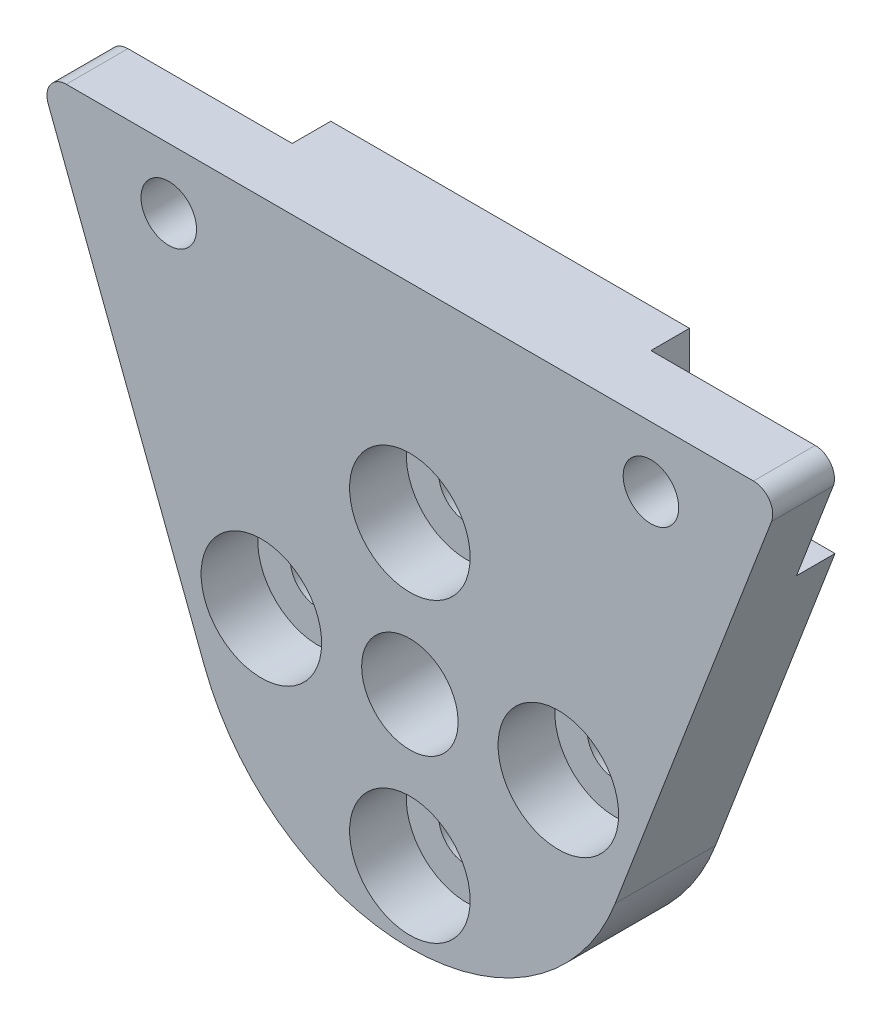
ISO-10303-21;
HEADER;
FILE_DESCRIPTION(('STEP AP214'),'2;1');
FILE_NAME('part.step','',(''),(''),'','','');
FILE_SCHEMA(('AUTOMOTIVE_DESIGN { 1 0 10303 214 1 1 1 1 }'));
ENDSEC;
DATA;
#1=APPLICATION_CONTEXT('core data for automotive mechanical design processes');
#2=APPLICATION_PROTOCOL_DEFINITION('international standard','automotive_design',2000,#1);
#3=PRODUCT_CONTEXT('',#1,'mechanical');
#4=PRODUCT('Part','Part','',(#3));
#5=PRODUCT_RELATED_PRODUCT_CATEGORY('part','',(#4));
#6=PRODUCT_DEFINITION_FORMATION('','',#4);
#7=PRODUCT_DEFINITION_CONTEXT('part definition',#1,'design');
#8=PRODUCT_DEFINITION('design','',#6,#7);
#9=PRODUCT_DEFINITION_SHAPE('','',#8);
#10=(LENGTH_UNIT() NAMED_UNIT(*) SI_UNIT(.MILLI.,.METRE.));
#11=(NAMED_UNIT(*) PLANE_ANGLE_UNIT() SI_UNIT($,.RADIAN.));
#12=(NAMED_UNIT(*) SI_UNIT($,.STERADIAN.) SOLID_ANGLE_UNIT());
#13=UNCERTAINTY_MEASURE_WITH_UNIT(LENGTH_MEASURE(1.E-05),#10,'distance_accuracy_value','');
#14=(GEOMETRIC_REPRESENTATION_CONTEXT(3) GLOBAL_UNCERTAINTY_ASSIGNED_CONTEXT((#13)) GLOBAL_UNIT_ASSIGNED_CONTEXT((#10,
#11,#12)) REPRESENTATION_CONTEXT('',''));
#15=CARTESIAN_POINT('',(0.,0.,0.));
#16=DIRECTION('',(0.,0.,1.));
#17=DIRECTION('',(1.,0.,0.));
#18=AXIS2_PLACEMENT_3D('',#15,#16,#17);
#19=CARTESIAN_POINT('',(-15.875,14.9987,0.));
#20=DIRECTION('',(0.,0.,-1.));
#21=DIRECTION('',(-1.,0.,0.));
#22=AXIS2_PLACEMENT_3D('',#19,#20,#21);
#23=CYLINDRICAL_SURFACE('',#22,1.8288);
#24=CARTESIAN_POINT('',(-15.875,14.9987,6.604));
#25=DIRECTION('',(0.,0.,-1.));
#26=DIRECTION('',(-1.,0.,0.));
#27=AXIS2_PLACEMENT_3D('',#24,#25,#26);
#28=CIRCLE('',#27,1.8288);
#29=CARTESIAN_POINT('',(-17.7038,14.9987,6.604));
#30=VERTEX_POINT('',#29);
#31=EDGE_CURVE('E214',#30,#30,#28,.T.);
#32=ORIENTED_EDGE('',*,*,#31,.F.);
#33=EDGE_LOOP('',(#32));
#34=FACE_BOUND('',#33,.T.);
#35=CARTESIAN_POINT('',(-15.875,14.9987,2.54));
#36=DIRECTION('',(0.,0.,-1.));
#37=DIRECTION('',(-1.,0.,0.));
#38=AXIS2_PLACEMENT_3D('',#35,#36,#37);
#39=CIRCLE('',#38,1.8288);
#40=CARTESIAN_POINT('',(-17.7038,14.9987,2.54));
#41=VERTEX_POINT('',#40);
#42=EDGE_CURVE('E175',#41,#41,#39,.F.);
#43=ORIENTED_EDGE('',*,*,#42,.F.);
#44=EDGE_LOOP('',(#43));
#45=FACE_BOUND('',#44,.T.);
#46=ADVANCED_FACE('F35',(#34,#45),#23,.F.);
#47=CARTESIAN_POINT('',(15.875,14.9987,0.));
#48=DIRECTION('',(0.,0.,-1.));
#49=DIRECTION('',(-1.,0.,0.));
#50=AXIS2_PLACEMENT_3D('',#47,#48,#49);
#51=CYLINDRICAL_SURFACE('',#50,1.8288);
#52=CARTESIAN_POINT('',(15.875,14.9987,6.604));
#53=DIRECTION('',(0.,0.,-1.));
#54=DIRECTION('',(-1.,0.,0.));
#55=AXIS2_PLACEMENT_3D('',#52,#53,#54);
#56=CIRCLE('',#55,1.8288);
#57=CARTESIAN_POINT('',(14.0462,14.9987,6.604));
#58=VERTEX_POINT('',#57);
#59=EDGE_CURVE('E211',#58,#58,#56,.T.);
#60=ORIENTED_EDGE('',*,*,#59,.F.);
#61=EDGE_LOOP('',(#60));
#62=FACE_BOUND('',#61,.T.);
#63=CARTESIAN_POINT('',(15.875,14.9987,2.54));
#64=DIRECTION('',(0.,0.,-1.));
#65=DIRECTION('',(-1.,0.,0.));
#66=AXIS2_PLACEMENT_3D('',#63,#64,#65);
#67=CIRCLE('',#66,1.8288);
#68=CARTESIAN_POINT('',(14.0462,14.9987,2.54));
#69=VERTEX_POINT('',#68);
#70=EDGE_CURVE('E205',#69,#69,#67,.F.);
#71=ORIENTED_EDGE('',*,*,#70,.F.);
#72=EDGE_LOOP('',(#71));
#73=FACE_BOUND('',#72,.T.);
#74=ADVANCED_FACE('F326',(#62,#73),#51,.F.);
#75=CARTESIAN_POINT('',(0.,-4.48645472172612,6.604));
#76=DIRECTION('',(0.,0.,1.));
#77=DIRECTION('',(1.,0.,0.));
#78=AXIS2_PLACEMENT_3D('',#75,#76,#77);
#79=PLANE('',#78);
#80=ORIENTED_EDGE('',*,*,#59,.T.);
#81=EDGE_LOOP('',(#80));
#82=FACE_BOUND('',#81,.T.);
#83=ORIENTED_EDGE('',*,*,#31,.T.);
#84=EDGE_LOOP('',(#83));
#85=FACE_BOUND('',#84,.T.);
#86=CARTESIAN_POINT('',(0.,5.29254527827388,6.604));
#87=DIRECTION('',(0.,0.,1.));
#88=DIRECTION('',(1.,0.,0.));
#89=AXIS2_PLACEMENT_3D('',#86,#87,#88);
#90=CIRCLE('',#89,3.96875);
#91=CARTESIAN_POINT('',(3.96875,5.29254527827388,6.604));
#92=VERTEX_POINT('',#91);
#93=EDGE_CURVE('E217',#92,#92,#90,.T.);
#94=ORIENTED_EDGE('',*,*,#93,.F.);
#95=EDGE_LOOP('',(#94));
#96=FACE_BOUND('',#95,.T.);
#97=CARTESIAN_POINT('',(9.779,-4.48645472172612,6.604));
#98=DIRECTION('',(0.,0.,1.));
#99=DIRECTION('',(1.,0.,0.));
#100=AXIS2_PLACEMENT_3D('',#97,#98,#99);
#101=CIRCLE('',#100,3.96875);
#102=CARTESIAN_POINT('',(13.74775,-4.48645472172612,6.604));
#103=VERTEX_POINT('',#102);
#104=EDGE_CURVE('E229',#103,#103,#101,.T.);
#105=ORIENTED_EDGE('',*,*,#104,.F.);
#106=EDGE_LOOP('',(#105));
#107=FACE_BOUND('',#106,.T.);
#108=CARTESIAN_POINT('',(-9.779,-4.48645472172612,6.604));
#109=DIRECTION('',(0.,0.,1.));
#110=DIRECTION('',(1.,0.,0.));
#111=AXIS2_PLACEMENT_3D('',#108,#109,#110);
#112=CIRCLE('',#111,3.96875);
#113=CARTESIAN_POINT('',(-5.81025,-4.48645472172612,6.604));
#114=VERTEX_POINT('',#113);
#115=EDGE_CURVE('E241',#114,#114,#112,.T.);
#116=ORIENTED_EDGE('',*,*,#115,.F.);
#117=EDGE_LOOP('',(#116));
#118=FACE_BOUND('',#117,.T.);
#119=CARTESIAN_POINT('',(0.,-14.2654547217261,6.604));
#120=DIRECTION('',(0.,0.,1.));
#121=DIRECTION('',(1.,0.,0.));
#122=AXIS2_PLACEMENT_3D('',#119,#120,#121);
#123=CIRCLE('',#122,3.96875);
#124=CARTESIAN_POINT('',(3.96875,-14.2654547217261,6.604));
#125=VERTEX_POINT('',#124);
#126=EDGE_CURVE('E253',#125,#125,#123,.T.);
#127=ORIENTED_EDGE('',*,*,#126,.F.);
#128=EDGE_LOOP('',(#127));
#129=FACE_BOUND('',#128,.T.);
#130=DIRECTION('',(0.35707305954078,0.934076458407012,0.));
#131=VECTOR('',#130,1.);
#132=CARTESIAN_POINT('',(24.4729,18.9865,6.604));
#133=LINE('',#132,#131);
#134=CARTESIAN_POINT('',(13.5235589648167,-9.65615847775755,6.604));
#135=VERTEX_POINT('',#134);
#136=CARTESIAN_POINT('',(23.8140574975612,17.2630172143832,6.604));
#137=VERTEX_POINT('',#136);
#138=EDGE_CURVE('E279',#135,#137,#133,.T.);
#139=ORIENTED_EDGE('',*,*,#138,.T.);
#140=CARTESIAN_POINT('',(22.6277803953843,17.7165,6.604));
#141=DIRECTION('',(0.,0.,1.));
#142=DIRECTION('',(1.,0.,0.));
#143=AXIS2_PLACEMENT_3D('',#140,#141,#142);
#144=CIRCLE('',#143,1.27);
#145=CARTESIAN_POINT('',(22.6277803953843,18.9865,6.604));
#146=VERTEX_POINT('',#145);
#147=EDGE_CURVE('E310',#137,#146,#144,.T.);
#148=ORIENTED_EDGE('',*,*,#147,.T.);
#149=DIRECTION('',(-1.,0.,0.));
#150=VECTOR('',#149,1.);
#151=CARTESIAN_POINT('',(24.4729,18.9865,6.604));
#152=LINE('',#151,#150);
#153=CARTESIAN_POINT('',(-22.6277803953843,18.9865,6.604));
#154=VERTEX_POINT('',#153);
#155=EDGE_CURVE('E272',#146,#154,#152,.T.);
#156=ORIENTED_EDGE('',*,*,#155,.T.);
#157=CARTESIAN_POINT('',(-22.6277803953843,17.7165,6.604));
#158=DIRECTION('',(0.,0.,1.));
#159=DIRECTION('',(1.,0.,0.));
#160=AXIS2_PLACEMENT_3D('',#157,#158,#159);
#161=CIRCLE('',#160,1.27);
#162=CARTESIAN_POINT('',(-23.8140574975612,17.2630172143832,6.604));
#163=VERTEX_POINT('',#162);
#164=EDGE_CURVE('E56',#154,#163,#161,.T.);
#165=ORIENTED_EDGE('',*,*,#164,.T.);
#166=DIRECTION('',(0.35707305954078,-0.934076458407012,0.));
#167=VECTOR('',#166,1.);
#168=CARTESIAN_POINT('',(-24.4729,18.9865,6.604));
#169=LINE('',#168,#167);
#170=CARTESIAN_POINT('',(-13.5235589648167,-9.65615847775754,6.604));
#171=VERTEX_POINT('',#170);
#172=EDGE_CURVE('E274',#163,#171,#169,.T.);
#173=ORIENTED_EDGE('',*,*,#172,.T.);
#174=CARTESIAN_POINT('',(0.,-4.48645472172612,6.604));
#175=DIRECTION('',(0.,0.,1.));
#176=DIRECTION('',(1.,0.,0.));
#177=AXIS2_PLACEMENT_3D('',#174,#175,#176);
#178=CIRCLE('',#177,14.478);
#179=EDGE_CURVE('E277',#171,#135,#178,.T.);
#180=ORIENTED_EDGE('',*,*,#179,.T.);
#181=EDGE_LOOP('',(#139,#148,#156,#165,#173,#180));
#182=FACE_BOUND('',#181,.T.);
#183=CARTESIAN_POINT('',(0.,-4.48645472172612,6.604));
#184=DIRECTION('',(0.,0.,1.));
#185=DIRECTION('',(1.,0.,0.));
#186=AXIS2_PLACEMENT_3D('',#183,#184,#185);
#187=CIRCLE('',#186,3.175);
#188=CARTESIAN_POINT('',(-3.175,-4.48645472172612,6.604));
#189=VERTEX_POINT('',#188);
#190=EDGE_CURVE('E266',#189,#189,#187,.T.);
#191=ORIENTED_EDGE('',*,*,#190,.F.);
#192=EDGE_LOOP('',(#191));
#193=FACE_BOUND('',#192,.T.);
#194=ADVANCED_FACE('F332',(#82,#85,#96,#107,#118,#129,#182,#193),#79,.T.);
#195=CARTESIAN_POINT('',(0.,-4.48645472172612,0.));
#196=DIRECTION('',(0.,0.,1.));
#197=DIRECTION('',(1.,0.,0.));
#198=AXIS2_PLACEMENT_3D('',#195,#196,#197);
#199=PLANE('',#198);
#200=CARTESIAN_POINT('',(0.,5.29254527827388,0.));
#201=DIRECTION('',(0.,0.,1.));
#202=DIRECTION('',(1.,0.,0.));
#203=AXIS2_PLACEMENT_3D('',#200,#201,#202);
#204=CIRCLE('',#203,1.8288);
#205=CARTESIAN_POINT('',(1.8288,5.29254527827388,0.));
#206=VERTEX_POINT('',#205);
#207=EDGE_CURVE('E226',#206,#206,#204,.T.);
#208=ORIENTED_EDGE('',*,*,#207,.T.);
#209=EDGE_LOOP('',(#208));
#210=FACE_BOUND('',#209,.T.);
#211=CARTESIAN_POINT('',(9.779,-4.48645472172612,0.));
#212=DIRECTION('',(0.,0.,1.));
#213=DIRECTION('',(1.,0.,0.));
#214=AXIS2_PLACEMENT_3D('',#211,#212,#213);
#215=CIRCLE('',#214,1.8288);
#216=CARTESIAN_POINT('',(11.6078,-4.48645472172612,0.));
#217=VERTEX_POINT('',#216);
#218=EDGE_CURVE('E238',#217,#217,#215,.T.);
#219=ORIENTED_EDGE('',*,*,#218,.T.);
#220=EDGE_LOOP('',(#219));
#221=FACE_BOUND('',#220,.T.);
#222=CARTESIAN_POINT('',(-9.779,-4.48645472172612,0.));
#223=DIRECTION('',(0.,0.,1.));
#224=DIRECTION('',(1.,0.,0.));
#225=AXIS2_PLACEMENT_3D('',#222,#223,#224);
#226=CIRCLE('',#225,1.8288);
#227=CARTESIAN_POINT('',(-7.9502,-4.48645472172612,0.));
#228=VERTEX_POINT('',#227);
#229=EDGE_CURVE('E250',#228,#228,#226,.T.);
#230=ORIENTED_EDGE('',*,*,#229,.T.);
#231=EDGE_LOOP('',(#230));
#232=FACE_BOUND('',#231,.T.);
#233=CARTESIAN_POINT('',(0.,-14.2654547217261,0.));
#234=DIRECTION('',(0.,0.,1.));
#235=DIRECTION('',(1.,0.,0.));
#236=AXIS2_PLACEMENT_3D('',#233,#234,#235);
#237=CIRCLE('',#236,1.8288);
#238=CARTESIAN_POINT('',(1.8288,-14.2654547217261,0.));
#239=VERTEX_POINT('',#238);
#240=EDGE_CURVE('E262',#239,#239,#237,.T.);
#241=ORIENTED_EDGE('',*,*,#240,.T.);
#242=EDGE_LOOP('',(#241));
#243=FACE_BOUND('',#242,.T.);
#244=CARTESIAN_POINT('',(-15.875,14.9987,0.));
#245=DIRECTION('',(0.,0.,-1.));
#246=DIRECTION('',(-1.,0.,0.));
#247=AXIS2_PLACEMENT_3D('',#244,#245,#246);
#248=CIRCLE('',#247,4.064);
#249=CARTESIAN_POINT('',(-11.811,14.9987,0.));
#250=VERTEX_POINT('',#249);
#251=CARTESIAN_POINT('',(-15.875,10.9347,0.));
#252=VERTEX_POINT('',#251);
#253=EDGE_CURVE('E143',#250,#252,#248,.T.);
#254=ORIENTED_EDGE('',*,*,#253,.F.);
#255=DIRECTION('',(0.,-1.,0.));
#256=VECTOR('',#255,1.);
#257=CARTESIAN_POINT('',(-11.811,14.9987,0.));
#258=LINE('',#257,#256);
#259=CARTESIAN_POINT('',(-11.811,18.9865,0.));
#260=VERTEX_POINT('',#259);
#261=EDGE_CURVE('E161',#260,#250,#258,.T.);
#262=ORIENTED_EDGE('',*,*,#261,.F.);
#263=DIRECTION('',(-1.,0.,0.));
#264=VECTOR('',#263,1.);
#265=CARTESIAN_POINT('',(24.4729,18.9865,0.));
#266=LINE('',#265,#264);
#267=CARTESIAN_POINT('',(11.811,18.9865,0.));
#268=VERTEX_POINT('',#267);
#269=EDGE_CURVE('E269',#268,#260,#266,.T.);
#270=ORIENTED_EDGE('',*,*,#269,.F.);
#271=DIRECTION('',(0.,1.,0.));
#272=VECTOR('',#271,1.);
#273=CARTESIAN_POINT('',(11.811,14.9987,0.));
#274=LINE('',#273,#272);
#275=CARTESIAN_POINT('',(11.811,14.9987,0.));
#276=VERTEX_POINT('',#275);
#277=EDGE_CURVE('E182',#276,#268,#274,.T.);
#278=ORIENTED_EDGE('',*,*,#277,.F.);
#279=CARTESIAN_POINT('',(15.875,14.9987,0.));
#280=DIRECTION('',(0.,0.,-1.));
#281=DIRECTION('',(-1.,0.,0.));
#282=AXIS2_PLACEMENT_3D('',#279,#280,#281);
#283=CIRCLE('',#282,4.064);
#284=CARTESIAN_POINT('',(15.875,10.9347,0.));
#285=VERTEX_POINT('',#284);
#286=EDGE_CURVE('E198',#285,#276,#283,.T.);
#287=ORIENTED_EDGE('',*,*,#286,.F.);
#288=DIRECTION('',(-1.,0.,0.));
#289=VECTOR('',#288,1.);
#290=CARTESIAN_POINT('',(15.875,10.9347,0.));
#291=LINE('',#290,#289);
#292=CARTESIAN_POINT('',(21.3949069353705,10.9347,0.));
#293=VERTEX_POINT('',#292);
#294=EDGE_CURVE('E195',#293,#285,#291,.T.);
#295=ORIENTED_EDGE('',*,*,#294,.F.);
#296=DIRECTION('',(0.35707305954078,0.934076458407012,0.));
#297=VECTOR('',#296,1.);
#298=CARTESIAN_POINT('',(24.4729,18.9865,0.));
#299=LINE('',#298,#297);
#300=CARTESIAN_POINT('',(13.5235589648167,-9.65615847775755,0.));
#301=VERTEX_POINT('',#300);
#302=EDGE_CURVE('E275',#301,#293,#299,.T.);
#303=ORIENTED_EDGE('',*,*,#302,.F.);
#304=CARTESIAN_POINT('',(0.,-4.48645472172612,0.));
#305=DIRECTION('',(0.,0.,1.));
#306=DIRECTION('',(1.,0.,0.));
#307=AXIS2_PLACEMENT_3D('',#304,#305,#306);
#308=CIRCLE('',#307,14.478);
#309=CARTESIAN_POINT('',(-13.5235589648167,-9.65615847775754,0.));
#310=VERTEX_POINT('',#309);
#311=EDGE_CURVE('E287',#310,#301,#308,.T.);
#312=ORIENTED_EDGE('',*,*,#311,.F.);
#313=DIRECTION('',(0.35707305954078,-0.934076458407012,0.));
#314=VECTOR('',#313,1.);
#315=CARTESIAN_POINT('',(-24.4729,18.9865,0.));
#316=LINE('',#315,#314);
#317=CARTESIAN_POINT('',(-21.3949069353705,10.9347,0.));
#318=VERTEX_POINT('',#317);
#319=EDGE_CURVE('E285',#318,#310,#316,.T.);
#320=ORIENTED_EDGE('',*,*,#319,.F.);
#321=DIRECTION('',(-1.,0.,0.));
#322=VECTOR('',#321,1.);
#323=CARTESIAN_POINT('',(-15.875,10.9347,0.));
#324=LINE('',#323,#322);
#325=EDGE_CURVE('E164',#252,#318,#324,.T.);
#326=ORIENTED_EDGE('',*,*,#325,.F.);
#327=EDGE_LOOP('',(#254,#262,#270,#278,#287,#295,#303,#312,#320,#326));
#328=FACE_BOUND('',#327,.T.);
#329=CARTESIAN_POINT('',(0.,-4.48645472172612,0.));
#330=DIRECTION('',(0.,0.,1.));
#331=DIRECTION('',(1.,0.,0.));
#332=AXIS2_PLACEMENT_3D('',#329,#330,#331);
#333=CIRCLE('',#332,3.175);
#334=CARTESIAN_POINT('',(-3.175,-4.48645472172612,0.));
#335=VERTEX_POINT('',#334);
#336=EDGE_CURVE('E265',#335,#335,#333,.T.);
#337=ORIENTED_EDGE('',*,*,#336,.T.);
#338=EDGE_LOOP('',(#337));
#339=FACE_BOUND('',#338,.T.);
#340=ADVANCED_FACE('F395',(#210,#221,#232,#243,#328,#339),#199,.F.);
#341=CARTESIAN_POINT('',(24.4729,18.9865,6.604));
#342=DIRECTION('',(0.,-1.,0.));
#343=DIRECTION('',(1.,0.,0.));
#344=AXIS2_PLACEMENT_3D('',#341,#342,#343);
#345=PLANE('',#344);
#346=ORIENTED_EDGE('',*,*,#155,.F.);
#347=DIRECTION('',(0.,0.,-1.));
#348=VECTOR('',#347,1.);
#349=CARTESIAN_POINT('',(22.6277803953843,18.9865,6.604));
#350=LINE('',#349,#348);
#351=CARTESIAN_POINT('',(22.6277803953843,18.9865,2.54));
#352=VERTEX_POINT('',#351);
#353=EDGE_CURVE('E302',#146,#352,#350,.T.);
#354=ORIENTED_EDGE('',*,*,#353,.T.);
#355=DIRECTION('',(1.,0.,0.));
#356=VECTOR('',#355,1.);
#357=CARTESIAN_POINT('',(11.811,18.9865,2.54));
#358=LINE('',#357,#356);
#359=CARTESIAN_POINT('',(11.811,18.9865,2.54));
#360=VERTEX_POINT('',#359);
#361=EDGE_CURVE('E191',#360,#352,#358,.T.);
#362=ORIENTED_EDGE('',*,*,#361,.F.);
#363=DIRECTION('',(0.,0.,-1.));
#364=VECTOR('',#363,1.);
#365=CARTESIAN_POINT('',(11.811,18.9865,2.54));
#366=LINE('',#365,#364);
#367=EDGE_CURVE('E202',#360,#268,#366,.T.);
#368=ORIENTED_EDGE('',*,*,#367,.T.);
#369=ORIENTED_EDGE('',*,*,#269,.T.);
#370=DIRECTION('',(0.,0.,-1.));
#371=VECTOR('',#370,1.);
#372=CARTESIAN_POINT('',(-11.811,18.9865,2.54));
#373=LINE('',#372,#371);
#374=CARTESIAN_POINT('',(-11.811,18.9865,2.54));
#375=VERTEX_POINT('',#374);
#376=EDGE_CURVE('E176',#375,#260,#373,.T.);
#377=ORIENTED_EDGE('',*,*,#376,.F.);
#378=DIRECTION('',(1.,0.,0.));
#379=VECTOR('',#378,1.);
#380=CARTESIAN_POINT('',(-11.811,18.9865,2.54));
#381=LINE('',#380,#379);
#382=CARTESIAN_POINT('',(-22.6277803953843,18.9865,2.54));
#383=VERTEX_POINT('',#382);
#384=EDGE_CURVE('E168',#383,#375,#381,.T.);
#385=ORIENTED_EDGE('',*,*,#384,.F.);
#386=DIRECTION('',(0.,0.,-1.));
#387=VECTOR('',#386,1.);
#388=CARTESIAN_POINT('',(-22.6277803953843,18.9865,6.604));
#389=LINE('',#388,#387);
#390=EDGE_CURVE('E296',#383,#154,#389,.F.);
#391=ORIENTED_EDGE('',*,*,#390,.T.);
#392=EDGE_LOOP('',(#346,#354,#362,#368,#369,#377,#385,#391));
#393=FACE_BOUND('',#392,.T.);
#394=ADVANCED_FACE('F318',(#393),#345,.F.);
#395=CARTESIAN_POINT('',(-24.4729,18.9865,6.604));
#396=DIRECTION('',(0.934076458407012,0.35707305954078,0.));
#397=DIRECTION('',(-0.35707305954078,0.934076458407012,0.));
#398=AXIS2_PLACEMENT_3D('',#395,#396,#397);
#399=PLANE('',#398);
#400=ORIENTED_EDGE('',*,*,#172,.F.);
#401=DIRECTION('',(0.,0.,-1.));
#402=VECTOR('',#401,1.);
#403=CARTESIAN_POINT('',(-23.8140574975612,17.2630172143832,6.604));
#404=LINE('',#403,#402);
#405=CARTESIAN_POINT('',(-23.8140574975612,17.2630172143832,2.54));
#406=VERTEX_POINT('',#405);
#407=EDGE_CURVE('E43',#163,#406,#404,.T.);
#408=ORIENTED_EDGE('',*,*,#407,.T.);
#409=DIRECTION('',(-0.35707305954078,0.934076458407012,0.));
#410=VECTOR('',#409,1.);
#411=CARTESIAN_POINT('',(-24.4729,18.9865,2.54));
#412=LINE('',#411,#410);
#413=CARTESIAN_POINT('',(-21.3949069353705,10.9347,2.54));
#414=VERTEX_POINT('',#413);
#415=EDGE_CURVE('E156',#414,#406,#412,.T.);
#416=ORIENTED_EDGE('',*,*,#415,.F.);
#417=DIRECTION('',(0.,0.,-1.));
#418=VECTOR('',#417,1.);
#419=CARTESIAN_POINT('',(-21.3949069353705,10.9347,2.54));
#420=LINE('',#419,#418);
#421=EDGE_CURVE('E146',#414,#318,#420,.T.);
#422=ORIENTED_EDGE('',*,*,#421,.T.);
#423=ORIENTED_EDGE('',*,*,#319,.T.);
#424=DIRECTION('',(0.,0.,-1.));
#425=VECTOR('',#424,1.);
#426=CARTESIAN_POINT('',(-13.5235589648167,-9.65615847775754,6.604));
#427=LINE('',#426,#425);
#428=EDGE_CURVE('E293',#171,#310,#427,.T.);
#429=ORIENTED_EDGE('',*,*,#428,.F.);
#430=EDGE_LOOP('',(#400,#408,#416,#422,#423,#429));
#431=FACE_BOUND('',#430,.T.);
#432=ADVANCED_FACE('F312',(#431),#399,.F.);
#433=CARTESIAN_POINT('',(0.,-4.48645472172612,6.604));
#434=DIRECTION('',(0.,0.,-1.));
#435=DIRECTION('',(-1.,0.,0.));
#436=AXIS2_PLACEMENT_3D('',#433,#434,#435);
#437=CYLINDRICAL_SURFACE('',#436,14.478);
#438=ORIENTED_EDGE('',*,*,#311,.T.);
#439=DIRECTION('',(0.,0.,-1.));
#440=VECTOR('',#439,1.);
#441=CARTESIAN_POINT('',(13.5235589648167,-9.65615847775755,6.604));
#442=LINE('',#441,#440);
#443=EDGE_CURVE('E282',#135,#301,#442,.T.);
#444=ORIENTED_EDGE('',*,*,#443,.F.);
#445=ORIENTED_EDGE('',*,*,#179,.F.);
#446=ORIENTED_EDGE('',*,*,#428,.T.);
#447=EDGE_LOOP('',(#438,#444,#445,#446));
#448=FACE_BOUND('',#447,.T.);
#449=ADVANCED_FACE('F402',(#448),#437,.T.);
#450=CARTESIAN_POINT('',(24.4729,18.9865,6.604));
#451=DIRECTION('',(-0.934076458407012,0.35707305954078,0.));
#452=DIRECTION('',(-0.35707305954078,-0.934076458407012,0.));
#453=AXIS2_PLACEMENT_3D('',#450,#451,#452);
#454=PLANE('',#453);
#455=DIRECTION('',(-0.35707305954078,-0.934076458407012,0.));
#456=VECTOR('',#455,1.);
#457=CARTESIAN_POINT('',(24.4729,18.9865,2.54));
#458=LINE('',#457,#456);
#459=CARTESIAN_POINT('',(23.8140574975612,17.2630172143832,2.54));
#460=VERTEX_POINT('',#459);
#461=CARTESIAN_POINT('',(21.3949069353705,10.9347,2.54));
#462=VERTEX_POINT('',#461);
#463=EDGE_CURVE('E179',#460,#462,#458,.T.);
#464=ORIENTED_EDGE('',*,*,#463,.F.);
#465=DIRECTION('',(0.,0.,-1.));
#466=VECTOR('',#465,1.);
#467=CARTESIAN_POINT('',(23.8140574975612,17.2630172143832,6.604));
#468=LINE('',#467,#466);
#469=EDGE_CURVE('E307',#460,#137,#468,.F.);
#470=ORIENTED_EDGE('',*,*,#469,.T.);
#471=ORIENTED_EDGE('',*,*,#138,.F.);
#472=ORIENTED_EDGE('',*,*,#443,.T.);
#473=ORIENTED_EDGE('',*,*,#302,.T.);
#474=DIRECTION('',(0.,0.,-1.));
#475=VECTOR('',#474,1.);
#476=CARTESIAN_POINT('',(21.3949069353705,10.9347,2.54));
#477=LINE('',#476,#475);
#478=EDGE_CURVE('E194',#462,#293,#477,.T.);
#479=ORIENTED_EDGE('',*,*,#478,.F.);
#480=EDGE_LOOP('',(#464,#470,#471,#472,#473,#479));
#481=FACE_BOUND('',#480,.T.);
#482=ADVANCED_FACE('F391',(#481),#454,.F.);
#483=CARTESIAN_POINT('',(0.,-4.48645472172612,6.604));
#484=DIRECTION('',(0.,0.,-1.));
#485=DIRECTION('',(-1.,0.,0.));
#486=AXIS2_PLACEMENT_3D('',#483,#484,#485);
#487=CYLINDRICAL_SURFACE('',#486,3.175);
#488=CARTESIAN_POINT('',(-3.175,-4.48645472172612,6.604));
#489=CARTESIAN_POINT('',(-3.175,-4.48645472172612,6.53520833333333));
#490=CARTESIAN_POINT('',(-3.175,-4.48645472172612,6.46641666666667));
#491=CARTESIAN_POINT('',(-3.175,-4.48645472172612,6.32883333333333));
#492=CARTESIAN_POINT('',(-3.175,-4.48645472172612,6.26004166666667));
#493=CARTESIAN_POINT('',(-3.175,-4.48645472172612,6.12245833333333));
#494=CARTESIAN_POINT('',(-3.175,-4.48645472172612,6.05366666666667));
#495=CARTESIAN_POINT('',(-3.175,-4.48645472172612,5.91608333333333));
#496=CARTESIAN_POINT('',(-3.175,-4.48645472172612,5.84729166666667));
#497=CARTESIAN_POINT('',(-3.175,-4.48645472172612,5.70970833333333));
#498=CARTESIAN_POINT('',(-3.175,-4.48645472172612,5.64091666666667));
#499=CARTESIAN_POINT('',(-3.175,-4.48645472172612,5.50333333333333));
#500=CARTESIAN_POINT('',(-3.175,-4.48645472172612,5.43454166666667));
#501=CARTESIAN_POINT('',(-3.175,-4.48645472172612,5.29695833333333));
#502=CARTESIAN_POINT('',(-3.175,-4.48645472172612,5.22816666666667));
#503=CARTESIAN_POINT('',(-3.175,-4.48645472172612,5.09058333333333));
#504=CARTESIAN_POINT('',(-3.175,-4.48645472172612,5.02179166666667));
#505=CARTESIAN_POINT('',(-3.175,-4.48645472172612,4.88420833333333));
#506=CARTESIAN_POINT('',(-3.175,-4.48645472172612,4.81541666666667));
#507=CARTESIAN_POINT('',(-3.175,-4.48645472172612,4.67783333333333));
#508=CARTESIAN_POINT('',(-3.175,-4.48645472172612,4.60904166666667));
#509=CARTESIAN_POINT('',(-3.175,-4.48645472172612,4.47145833333333));
#510=CARTESIAN_POINT('',(-3.175,-4.48645472172612,4.40266666666667));
#511=CARTESIAN_POINT('',(-3.175,-4.48645472172612,4.26508333333333));
#512=CARTESIAN_POINT('',(-3.175,-4.48645472172612,4.19629166666667));
#513=CARTESIAN_POINT('',(-3.175,-4.48645472172612,4.05870833333333));
#514=CARTESIAN_POINT('',(-3.175,-4.48645472172612,3.98991666666667));
#515=CARTESIAN_POINT('',(-3.175,-4.48645472172612,3.85233333333333));
#516=CARTESIAN_POINT('',(-3.175,-4.48645472172612,3.78354166666667));
#517=CARTESIAN_POINT('',(-3.175,-4.48645472172612,3.64595833333333));
#518=CARTESIAN_POINT('',(-3.175,-4.48645472172612,3.57716666666667));
#519=CARTESIAN_POINT('',(-3.175,-4.48645472172612,3.43958333333333));
#520=CARTESIAN_POINT('',(-3.175,-4.48645472172612,3.37079166666667));
#521=CARTESIAN_POINT('',(-3.175,-4.48645472172612,3.23320833333333));
#522=CARTESIAN_POINT('',(-3.175,-4.48645472172612,3.16441666666667));
#523=CARTESIAN_POINT('',(-3.175,-4.48645472172612,3.02683333333333));
#524=CARTESIAN_POINT('',(-3.175,-4.48645472172612,2.95804166666667));
#525=CARTESIAN_POINT('',(-3.175,-4.48645472172612,2.82045833333333));
#526=CARTESIAN_POINT('',(-3.175,-4.48645472172612,2.75166666666667));
#527=CARTESIAN_POINT('',(-3.175,-4.48645472172612,2.61408333333333));
#528=CARTESIAN_POINT('',(-3.175,-4.48645472172612,2.54529166666667));
#529=CARTESIAN_POINT('',(-3.175,-4.48645472172612,2.40770833333333));
#530=CARTESIAN_POINT('',(-3.175,-4.48645472172612,2.33891666666667));
#531=CARTESIAN_POINT('',(-3.175,-4.48645472172612,2.20133333333333));
#532=CARTESIAN_POINT('',(-3.175,-4.48645472172612,2.13254166666667));
#533=CARTESIAN_POINT('',(-3.175,-4.48645472172612,1.99495833333333));
#534=CARTESIAN_POINT('',(-3.175,-4.48645472172612,1.92616666666667));
#535=CARTESIAN_POINT('',(-3.175,-4.48645472172612,1.78858333333333));
#536=CARTESIAN_POINT('',(-3.175,-4.48645472172612,1.71979166666667));
#537=CARTESIAN_POINT('',(-3.175,-4.48645472172612,1.58220833333333));
#538=CARTESIAN_POINT('',(-3.175,-4.48645472172612,1.51341666666667));
#539=CARTESIAN_POINT('',(-3.175,-4.48645472172612,1.37583333333333));
#540=CARTESIAN_POINT('',(-3.175,-4.48645472172612,1.30704166666667));
#541=CARTESIAN_POINT('',(-3.175,-4.48645472172612,1.16945833333333));
#542=CARTESIAN_POINT('',(-3.175,-4.48645472172612,1.10066666666667));
#543=CARTESIAN_POINT('',(-3.175,-4.48645472172612,0.963083333333333));
#544=CARTESIAN_POINT('',(-3.175,-4.48645472172612,0.894291666666666));
#545=CARTESIAN_POINT('',(-3.175,-4.48645472172612,0.756708333333333));
#546=CARTESIAN_POINT('',(-3.175,-4.48645472172612,0.687916666666667));
#547=CARTESIAN_POINT('',(-3.175,-4.48645472172612,0.550333333333333));
#548=CARTESIAN_POINT('',(-3.175,-4.48645472172612,0.481541666666667));
#549=CARTESIAN_POINT('',(-3.175,-4.48645472172612,0.343958333333333));
#550=CARTESIAN_POINT('',(-3.175,-4.48645472172612,0.275166666666667));
#551=CARTESIAN_POINT('',(-3.175,-4.48645472172612,0.137583333333333));
#552=CARTESIAN_POINT('',(-3.175,-4.48645472172612,0.0687916666666666));
#553=CARTESIAN_POINT('',(-3.175,-4.48645472172612,0.));
#554=B_SPLINE_CURVE_WITH_KNOTS('',3,(#488,#489,#490,#491,#492,#493,#494,#495,#496,#497,#498,
#499,#500,#501,#502,#503,#504,#505,#506,#507,#508,#509,#510,#511,#512,#513,#514,#515,#516,#517,
#518,#519,#520,#521,#522,#523,#524,#525,#526,#527,#528,#529,#530,#531,#532,#533,#534,#535,#536,
#537,#538,#539,#540,#541,#542,#543,#544,#545,#546,#547,#548,#549,#550,#551,#552,#553),
.UNSPECIFIED.,.F.,.F.,(4,2,2,2,2,2,2,2,2,2,2,2,2,2,2,2,2,2,2,2,2,2,2,2,2,2,2,2,2,2,2,2,4),(0.,
0.206375,0.41275,0.619125,0.8255,1.031875,1.23825,1.444625,1.651,1.857375,2.06375,2.270125,
2.4765,2.682875,2.88925,3.095625,3.302,3.508375,3.71475,3.921125,4.1275,4.333875,4.54025,
4.746625,4.953,5.159375,5.36575,5.572125,5.7785,5.984875,6.19125,6.397625,6.604),.UNSPECIFIED.);
#555=EDGE_CURVE('BSEAM387',#189,#335,#554,.T.);
#556=ORIENTED_EDGE('',*,*,#190,.T.);
#557=ORIENTED_EDGE('',*,*,#336,.F.);
#558=ORIENTED_EDGE('',*,*,#555,.T.);
#559=ORIENTED_EDGE('',*,*,#555,.F.);
#560=EDGE_LOOP('',(#556,#558,#557,#559));
#561=FACE_BOUND('',#560,.T.);
#562=ADVANCED_FACE('F387',(#561),#487,.F.);
#563=CARTESIAN_POINT('',(0.,-14.2654547217261,6.604));
#564=DIRECTION('',(0.,0.,1.));
#565=DIRECTION('',(1.,0.,0.));
#566=AXIS2_PLACEMENT_3D('',#563,#564,#565);
#567=CYLINDRICAL_SURFACE('',#566,1.8288);
#568=ORIENTED_EDGE('',*,*,#240,.F.);
#569=EDGE_LOOP('',(#568));
#570=FACE_BOUND('',#569,.T.);
#571=CARTESIAN_POINT('',(0.,-14.2654547217261,2.8702));
#572=DIRECTION('',(0.,0.,1.));
#573=DIRECTION('',(1.,0.,0.));
#574=AXIS2_PLACEMENT_3D('',#571,#572,#573);
#575=CIRCLE('',#574,1.8288);
#576=CARTESIAN_POINT('',(1.8288,-14.2654547217261,2.8702));
#577=VERTEX_POINT('',#576);
#578=EDGE_CURVE('E259',#577,#577,#575,.T.);
#579=ORIENTED_EDGE('',*,*,#578,.T.);
#580=EDGE_LOOP('',(#579));
#581=FACE_BOUND('',#580,.T.);
#582=ADVANCED_FACE('F383',(#570,#581),#567,.F.);
#583=CARTESIAN_POINT('',(1.8288,-14.2654547217261,2.8702));
#584=DIRECTION('',(0.,0.,-1.));
#585=DIRECTION('',(-1.,0.,0.));
#586=AXIS2_PLACEMENT_3D('',#583,#584,#585);
#587=PLANE('',#586);
#588=ORIENTED_EDGE('',*,*,#578,.F.);
#589=EDGE_LOOP('',(#588));
#590=FACE_BOUND('',#589,.T.);
#591=CARTESIAN_POINT('',(0.,-14.2654547217261,2.8702));
#592=DIRECTION('',(0.,0.,1.));
#593=DIRECTION('',(1.,0.,0.));
#594=AXIS2_PLACEMENT_3D('',#591,#592,#593);
#595=CIRCLE('',#594,3.96875);
#596=CARTESIAN_POINT('',(3.96875,-14.2654547217261,2.8702));
#597=VERTEX_POINT('',#596);
#598=EDGE_CURVE('E256',#597,#597,#595,.T.);
#599=ORIENTED_EDGE('',*,*,#598,.T.);
#600=EDGE_LOOP('',(#599));
#601=FACE_BOUND('',#600,.T.);
#602=ADVANCED_FACE('F379',(#590,#601),#587,.F.);
#603=CARTESIAN_POINT('',(0.,-14.2654547217261,6.604));
#604=DIRECTION('',(0.,0.,1.));
#605=DIRECTION('',(1.,0.,0.));
#606=AXIS2_PLACEMENT_3D('',#603,#604,#605);
#607=CYLINDRICAL_SURFACE('',#606,3.96875);
#608=ORIENTED_EDGE('',*,*,#598,.F.);
#609=EDGE_LOOP('',(#608));
#610=FACE_BOUND('',#609,.T.);
#611=ORIENTED_EDGE('',*,*,#126,.T.);
#612=EDGE_LOOP('',(#611));
#613=FACE_BOUND('',#612,.T.);
#614=ADVANCED_FACE('F375',(#610,#613),#607,.F.);
#615=CARTESIAN_POINT('',(-9.779,-4.48645472172612,6.604));
#616=DIRECTION('',(0.,0.,1.));
#617=DIRECTION('',(1.,0.,0.));
#618=AXIS2_PLACEMENT_3D('',#615,#616,#617);
#619=CYLINDRICAL_SURFACE('',#618,1.8288);
#620=ORIENTED_EDGE('',*,*,#229,.F.);
#621=EDGE_LOOP('',(#620));
#622=FACE_BOUND('',#621,.T.);
#623=CARTESIAN_POINT('',(-9.779,-4.48645472172612,2.8702));
#624=DIRECTION('',(0.,0.,1.));
#625=DIRECTION('',(1.,0.,0.));
#626=AXIS2_PLACEMENT_3D('',#623,#624,#625);
#627=CIRCLE('',#626,1.8288);
#628=CARTESIAN_POINT('',(-7.9502,-4.48645472172612,2.8702));
#629=VERTEX_POINT('',#628);
#630=EDGE_CURVE('E247',#629,#629,#627,.T.);
#631=ORIENTED_EDGE('',*,*,#630,.T.);
#632=EDGE_LOOP('',(#631));
#633=FACE_BOUND('',#632,.T.);
#634=ADVANCED_FACE('F371',(#622,#633),#619,.F.);
#635=CARTESIAN_POINT('',(-7.9502,-4.48645472172612,2.8702));
#636=DIRECTION('',(0.,0.,-1.));
#637=DIRECTION('',(-1.,0.,0.));
#638=AXIS2_PLACEMENT_3D('',#635,#636,#637);
#639=PLANE('',#638);
#640=ORIENTED_EDGE('',*,*,#630,.F.);
#641=EDGE_LOOP('',(#640));
#642=FACE_BOUND('',#641,.T.);
#643=CARTESIAN_POINT('',(-9.779,-4.48645472172612,2.8702));
#644=DIRECTION('',(0.,0.,1.));
#645=DIRECTION('',(1.,0.,0.));
#646=AXIS2_PLACEMENT_3D('',#643,#644,#645);
#647=CIRCLE('',#646,3.96875);
#648=CARTESIAN_POINT('',(-5.81025,-4.48645472172612,2.8702));
#649=VERTEX_POINT('',#648);
#650=EDGE_CURVE('E244',#649,#649,#647,.T.);
#651=ORIENTED_EDGE('',*,*,#650,.T.);
#652=EDGE_LOOP('',(#651));
#653=FACE_BOUND('',#652,.T.);
#654=ADVANCED_FACE('F367',(#642,#653),#639,.F.);
#655=CARTESIAN_POINT('',(-9.779,-4.48645472172612,6.604));
#656=DIRECTION('',(0.,0.,1.));
#657=DIRECTION('',(1.,0.,0.));
#658=AXIS2_PLACEMENT_3D('',#655,#656,#657);
#659=CYLINDRICAL_SURFACE('',#658,3.96875);
#660=ORIENTED_EDGE('',*,*,#650,.F.);
#661=EDGE_LOOP('',(#660));
#662=FACE_BOUND('',#661,.T.);
#663=ORIENTED_EDGE('',*,*,#115,.T.);
#664=EDGE_LOOP('',(#663));
#665=FACE_BOUND('',#664,.T.);
#666=ADVANCED_FACE('F363',(#662,#665),#659,.F.);
#667=CARTESIAN_POINT('',(9.779,-4.48645472172612,6.604));
#668=DIRECTION('',(0.,0.,1.));
#669=DIRECTION('',(1.,0.,0.));
#670=AXIS2_PLACEMENT_3D('',#667,#668,#669);
#671=CYLINDRICAL_SURFACE('',#670,1.8288);
#672=ORIENTED_EDGE('',*,*,#218,.F.);
#673=EDGE_LOOP('',(#672));
#674=FACE_BOUND('',#673,.T.);
#675=CARTESIAN_POINT('',(9.779,-4.48645472172612,2.8702));
#676=DIRECTION('',(0.,0.,1.));
#677=DIRECTION('',(1.,0.,0.));
#678=AXIS2_PLACEMENT_3D('',#675,#676,#677);
#679=CIRCLE('',#678,1.8288);
#680=CARTESIAN_POINT('',(11.6078,-4.48645472172612,2.8702));
#681=VERTEX_POINT('',#680);
#682=EDGE_CURVE('E235',#681,#681,#679,.T.);
#683=ORIENTED_EDGE('',*,*,#682,.T.);
#684=EDGE_LOOP('',(#683));
#685=FACE_BOUND('',#684,.T.);
#686=ADVANCED_FACE('F359',(#674,#685),#671,.F.);
#687=CARTESIAN_POINT('',(11.6078,-4.48645472172612,2.8702));
#688=DIRECTION('',(0.,0.,-1.));
#689=DIRECTION('',(-1.,0.,0.));
#690=AXIS2_PLACEMENT_3D('',#687,#688,#689);
#691=PLANE('',#690);
#692=ORIENTED_EDGE('',*,*,#682,.F.);
#693=EDGE_LOOP('',(#692));
#694=FACE_BOUND('',#693,.T.);
#695=CARTESIAN_POINT('',(9.779,-4.48645472172612,2.8702));
#696=DIRECTION('',(0.,0.,1.));
#697=DIRECTION('',(1.,0.,0.));
#698=AXIS2_PLACEMENT_3D('',#695,#696,#697);
#699=CIRCLE('',#698,3.96875);
#700=CARTESIAN_POINT('',(13.74775,-4.48645472172612,2.8702));
#701=VERTEX_POINT('',#700);
#702=EDGE_CURVE('E232',#701,#701,#699,.T.);
#703=ORIENTED_EDGE('',*,*,#702,.T.);
#704=EDGE_LOOP('',(#703));
#705=FACE_BOUND('',#704,.T.);
#706=ADVANCED_FACE('F355',(#694,#705),#691,.F.);
#707=CARTESIAN_POINT('',(9.779,-4.48645472172612,6.604));
#708=DIRECTION('',(0.,0.,1.));
#709=DIRECTION('',(1.,0.,0.));
#710=AXIS2_PLACEMENT_3D('',#707,#708,#709);
#711=CYLINDRICAL_SURFACE('',#710,3.96875);
#712=ORIENTED_EDGE('',*,*,#702,.F.);
#713=EDGE_LOOP('',(#712));
#714=FACE_BOUND('',#713,.T.);
#715=ORIENTED_EDGE('',*,*,#104,.T.);
#716=EDGE_LOOP('',(#715));
#717=FACE_BOUND('',#716,.T.);
#718=ADVANCED_FACE('F351',(#714,#717),#711,.F.);
#719=CARTESIAN_POINT('',(0.,5.29254527827388,6.604));
#720=DIRECTION('',(0.,0.,1.));
#721=DIRECTION('',(1.,0.,0.));
#722=AXIS2_PLACEMENT_3D('',#719,#720,#721);
#723=CYLINDRICAL_SURFACE('',#722,1.8288);
#724=ORIENTED_EDGE('',*,*,#207,.F.);
#725=EDGE_LOOP('',(#724));
#726=FACE_BOUND('',#725,.T.);
#727=CARTESIAN_POINT('',(0.,5.29254527827388,2.8702));
#728=DIRECTION('',(0.,0.,1.));
#729=DIRECTION('',(1.,0.,0.));
#730=AXIS2_PLACEMENT_3D('',#727,#728,#729);
#731=CIRCLE('',#730,1.8288);
#732=CARTESIAN_POINT('',(1.8288,5.29254527827388,2.8702));
#733=VERTEX_POINT('',#732);
#734=EDGE_CURVE('E223',#733,#733,#731,.T.);
#735=ORIENTED_EDGE('',*,*,#734,.T.);
#736=EDGE_LOOP('',(#735));
#737=FACE_BOUND('',#736,.T.);
#738=ADVANCED_FACE('F347',(#726,#737),#723,.F.);
#739=CARTESIAN_POINT('',(1.8288,5.29254527827388,2.8702));
#740=DIRECTION('',(0.,0.,-1.));
#741=DIRECTION('',(-1.,0.,0.));
#742=AXIS2_PLACEMENT_3D('',#739,#740,#741);
#743=PLANE('',#742);
#744=ORIENTED_EDGE('',*,*,#734,.F.);
#745=EDGE_LOOP('',(#744));
#746=FACE_BOUND('',#745,.T.);
#747=CARTESIAN_POINT('',(0.,5.29254527827388,2.8702));
#748=DIRECTION('',(0.,0.,1.));
#749=DIRECTION('',(1.,0.,0.));
#750=AXIS2_PLACEMENT_3D('',#747,#748,#749);
#751=CIRCLE('',#750,3.96875);
#752=CARTESIAN_POINT('',(3.96875,5.29254527827388,2.8702));
#753=VERTEX_POINT('',#752);
#754=EDGE_CURVE('E220',#753,#753,#751,.T.);
#755=ORIENTED_EDGE('',*,*,#754,.T.);
#756=EDGE_LOOP('',(#755));
#757=FACE_BOUND('',#756,.T.);
#758=ADVANCED_FACE('F343',(#746,#757),#743,.F.);
#759=CARTESIAN_POINT('',(0.,5.29254527827388,6.604));
#760=DIRECTION('',(0.,0.,1.));
#761=DIRECTION('',(1.,0.,0.));
#762=AXIS2_PLACEMENT_3D('',#759,#760,#761);
#763=CYLINDRICAL_SURFACE('',#762,3.96875);
#764=ORIENTED_EDGE('',*,*,#754,.F.);
#765=EDGE_LOOP('',(#764));
#766=FACE_BOUND('',#765,.T.);
#767=ORIENTED_EDGE('',*,*,#93,.T.);
#768=EDGE_LOOP('',(#767));
#769=FACE_BOUND('',#768,.T.);
#770=ADVANCED_FACE('F339',(#766,#769),#763,.F.);
#771=CARTESIAN_POINT('',(15.875,14.9987,2.54));
#772=DIRECTION('',(0.,0.,-1.));
#773=DIRECTION('',(-1.,0.,0.));
#774=AXIS2_PLACEMENT_3D('',#771,#772,#773);
#775=PLANE('',#774);
#776=ORIENTED_EDGE('',*,*,#361,.T.);
#777=CARTESIAN_POINT('',(22.6277803953843,17.7165,2.54));
#778=DIRECTION('',(0.,0.,-1.));
#779=DIRECTION('',(-1.,0.,0.));
#780=AXIS2_PLACEMENT_3D('',#777,#778,#779);
#781=CIRCLE('',#780,1.27);
#782=EDGE_CURVE('E305',#352,#460,#781,.T.);
#783=ORIENTED_EDGE('',*,*,#782,.T.);
#784=ORIENTED_EDGE('',*,*,#463,.T.);
#785=DIRECTION('',(-1.,0.,0.));
#786=VECTOR('',#785,1.);
#787=CARTESIAN_POINT('',(15.875,10.9347,2.54));
#788=LINE('',#787,#786);
#789=CARTESIAN_POINT('',(15.875,10.9347,2.54));
#790=VERTEX_POINT('',#789);
#791=EDGE_CURVE('E181',#462,#790,#788,.T.);
#792=ORIENTED_EDGE('',*,*,#791,.T.);
#793=CARTESIAN_POINT('',(15.875,14.9987,2.54));
#794=DIRECTION('',(0.,0.,-1.));
#795=DIRECTION('',(-1.,0.,0.));
#796=AXIS2_PLACEMENT_3D('',#793,#794,#795);
#797=CIRCLE('',#796,4.064);
#798=CARTESIAN_POINT('',(11.811,14.9987,2.54));
#799=VERTEX_POINT('',#798);
#800=EDGE_CURVE('E185',#790,#799,#797,.T.);
#801=ORIENTED_EDGE('',*,*,#800,.T.);
#802=DIRECTION('',(0.,1.,0.));
#803=VECTOR('',#802,1.);
#804=CARTESIAN_POINT('',(11.811,14.9987,2.54));
#805=LINE('',#804,#803);
#806=EDGE_CURVE('E188',#799,#360,#805,.T.);
#807=ORIENTED_EDGE('',*,*,#806,.T.);
#808=EDGE_LOOP('',(#776,#783,#784,#792,#801,#807));
#809=FACE_BOUND('',#808,.T.);
#810=ORIENTED_EDGE('',*,*,#70,.T.);
#811=EDGE_LOOP('',(#810));
#812=FACE_BOUND('',#811,.T.);
#813=ADVANCED_FACE('F342',(#809,#812),#775,.T.);
#814=CARTESIAN_POINT('',(11.811,14.9987,2.54));
#815=DIRECTION('',(-1.,0.,0.));
#816=DIRECTION('',(0.,0.,1.));
#817=AXIS2_PLACEMENT_3D('',#814,#815,#816);
#818=PLANE('',#817);
#819=ORIENTED_EDGE('',*,*,#277,.T.);
#820=ORIENTED_EDGE('',*,*,#367,.F.);
#821=ORIENTED_EDGE('',*,*,#806,.F.);
#822=DIRECTION('',(0.,0.,-1.));
#823=VECTOR('',#822,1.);
#824=CARTESIAN_POINT('',(11.811,14.9987,2.54));
#825=LINE('',#824,#823);
#826=EDGE_CURVE('E206',#799,#276,#825,.T.);
#827=ORIENTED_EDGE('',*,*,#826,.T.);
#828=EDGE_LOOP('',(#819,#820,#821,#827));
#829=FACE_BOUND('',#828,.T.);
#830=ADVANCED_FACE('F421',(#829),#818,.F.);
#831=CARTESIAN_POINT('',(15.875,14.9987,2.54));
#832=DIRECTION('',(0.,0.,-1.));
#833=DIRECTION('',(-1.,0.,0.));
#834=AXIS2_PLACEMENT_3D('',#831,#832,#833);
#835=CYLINDRICAL_SURFACE('',#834,4.064);
#836=ORIENTED_EDGE('',*,*,#286,.T.);
#837=ORIENTED_EDGE('',*,*,#826,.F.);
#838=ORIENTED_EDGE('',*,*,#800,.F.);
#839=DIRECTION('',(0.,0.,-1.));
#840=VECTOR('',#839,1.);
#841=CARTESIAN_POINT('',(15.875,10.9347,2.54));
#842=LINE('',#841,#840);
#843=EDGE_CURVE('E208',#790,#285,#842,.T.);
#844=ORIENTED_EDGE('',*,*,#843,.T.);
#845=EDGE_LOOP('',(#836,#837,#838,#844));
#846=FACE_BOUND('',#845,.T.);
#847=ADVANCED_FACE('F473',(#846),#835,.F.);
#848=CARTESIAN_POINT('',(15.875,10.9347,2.54));
#849=DIRECTION('',(0.,-1.,0.));
#850=DIRECTION('',(1.,0.,0.));
#851=AXIS2_PLACEMENT_3D('',#848,#849,#850);
#852=PLANE('',#851);
#853=ORIENTED_EDGE('',*,*,#294,.T.);
#854=ORIENTED_EDGE('',*,*,#843,.F.);
#855=ORIENTED_EDGE('',*,*,#791,.F.);
#856=ORIENTED_EDGE('',*,*,#478,.T.);
#857=EDGE_LOOP('',(#853,#854,#855,#856));
#858=FACE_BOUND('',#857,.T.);
#859=ADVANCED_FACE('F429',(#858),#852,.F.);
#860=CARTESIAN_POINT('',(-15.875,14.9987,2.54));
#861=DIRECTION('',(0.,0.,-1.));
#862=DIRECTION('',(-1.,0.,0.));
#863=AXIS2_PLACEMENT_3D('',#860,#861,#862);
#864=PLANE('',#863);
#865=ORIENTED_EDGE('',*,*,#415,.T.);
#866=CARTESIAN_POINT('',(-22.6277803953843,17.7165,2.54));
#867=DIRECTION('',(0.,0.,-1.));
#868=DIRECTION('',(-1.,0.,0.));
#869=AXIS2_PLACEMENT_3D('',#866,#867,#868);
#870=CIRCLE('',#869,1.27);
#871=EDGE_CURVE('E11',#406,#383,#870,.T.);
#872=ORIENTED_EDGE('',*,*,#871,.T.);
#873=ORIENTED_EDGE('',*,*,#384,.T.);
#874=DIRECTION('',(0.,-1.,0.));
#875=VECTOR('',#874,1.);
#876=CARTESIAN_POINT('',(-11.811,14.9987,2.54));
#877=LINE('',#876,#875);
#878=CARTESIAN_POINT('',(-11.811,14.9987,2.54));
#879=VERTEX_POINT('',#878);
#880=EDGE_CURVE('E147',#375,#879,#877,.T.);
#881=ORIENTED_EDGE('',*,*,#880,.T.);
#882=CARTESIAN_POINT('',(-15.875,14.9987,2.54));
#883=DIRECTION('',(0.,0.,-1.));
#884=DIRECTION('',(-1.,0.,0.));
#885=AXIS2_PLACEMENT_3D('',#882,#883,#884);
#886=CIRCLE('',#885,4.064);
#887=CARTESIAN_POINT('',(-15.875,10.9347,2.54));
#888=VERTEX_POINT('',#887);
#889=EDGE_CURVE('E140',#879,#888,#886,.T.);
#890=ORIENTED_EDGE('',*,*,#889,.T.);
#891=DIRECTION('',(-1.,0.,0.));
#892=VECTOR('',#891,1.);
#893=CARTESIAN_POINT('',(-15.875,10.9347,2.54));
#894=LINE('',#893,#892);
#895=EDGE_CURVE('E150',#888,#414,#894,.T.);
#896=ORIENTED_EDGE('',*,*,#895,.T.);
#897=EDGE_LOOP('',(#865,#872,#873,#881,#890,#896));
#898=FACE_BOUND('',#897,.T.);
#899=ORIENTED_EDGE('',*,*,#42,.T.);
#900=EDGE_LOOP('',(#899));
#901=FACE_BOUND('',#900,.T.);
#902=ADVANCED_FACE('F158',(#898,#901),#864,.T.);
#903=CARTESIAN_POINT('',(-15.875,14.9987,2.54));
#904=DIRECTION('',(0.,0.,-1.));
#905=DIRECTION('',(-1.,0.,0.));
#906=AXIS2_PLACEMENT_3D('',#903,#904,#905);
#907=CYLINDRICAL_SURFACE('',#906,4.064);
#908=ORIENTED_EDGE('',*,*,#253,.T.);
#909=DIRECTION('',(0.,0.,-1.));
#910=VECTOR('',#909,1.);
#911=CARTESIAN_POINT('',(-15.875,10.9347,2.54));
#912=LINE('',#911,#910);
#913=EDGE_CURVE('E136',#888,#252,#912,.T.);
#914=ORIENTED_EDGE('',*,*,#913,.F.);
#915=ORIENTED_EDGE('',*,*,#889,.F.);
#916=DIRECTION('',(0.,0.,-1.));
#917=VECTOR('',#916,1.);
#918=CARTESIAN_POINT('',(-11.811,14.9987,2.54));
#919=LINE('',#918,#917);
#920=EDGE_CURVE('E173',#879,#250,#919,.T.);
#921=ORIENTED_EDGE('',*,*,#920,.T.);
#922=EDGE_LOOP('',(#908,#914,#915,#921));
#923=FACE_BOUND('',#922,.T.);
#924=ADVANCED_FACE('F138',(#923),#907,.F.);
#925=CARTESIAN_POINT('',(-11.811,14.9987,2.54));
#926=DIRECTION('',(1.,0.,0.));
#927=DIRECTION('',(0.,0.,-1.));
#928=AXIS2_PLACEMENT_3D('',#925,#926,#927);
#929=PLANE('',#928);
#930=ORIENTED_EDGE('',*,*,#261,.T.);
#931=ORIENTED_EDGE('',*,*,#920,.F.);
#932=ORIENTED_EDGE('',*,*,#880,.F.);
#933=ORIENTED_EDGE('',*,*,#376,.T.);
#934=EDGE_LOOP('',(#930,#931,#932,#933));
#935=FACE_BOUND('',#934,.T.);
#936=ADVANCED_FACE('F447',(#935),#929,.F.);
#937=CARTESIAN_POINT('',(-15.875,10.9347,2.54));
#938=DIRECTION('',(0.,-1.,0.));
#939=DIRECTION('',(1.,0.,0.));
#940=AXIS2_PLACEMENT_3D('',#937,#938,#939);
#941=PLANE('',#940);
#942=ORIENTED_EDGE('',*,*,#325,.T.);
#943=ORIENTED_EDGE('',*,*,#421,.F.);
#944=ORIENTED_EDGE('',*,*,#895,.F.);
#945=ORIENTED_EDGE('',*,*,#913,.T.);
#946=EDGE_LOOP('',(#942,#943,#944,#945));
#947=FACE_BOUND('',#946,.T.);
#948=ADVANCED_FACE('F151',(#947),#941,.F.);
#949=CARTESIAN_POINT('',(22.6277803953843,17.7165,6.604));
#950=DIRECTION('',(0.,0.,-1.));
#951=DIRECTION('',(-1.,0.,0.));
#952=AXIS2_PLACEMENT_3D('',#949,#950,#951);
#953=CYLINDRICAL_SURFACE('',#952,1.27);
#954=ORIENTED_EDGE('',*,*,#147,.F.);
#955=ORIENTED_EDGE('',*,*,#469,.F.);
#956=ORIENTED_EDGE('',*,*,#782,.F.);
#957=ORIENTED_EDGE('',*,*,#353,.F.);
#958=EDGE_LOOP('',(#954,#955,#956,#957));
#959=FACE_BOUND('',#958,.T.);
#960=ADVANCED_FACE('F320',(#959),#953,.T.);
#961=CARTESIAN_POINT('',(-22.6277803953843,17.7165,6.604));
#962=DIRECTION('',(0.,0.,-1.));
#963=DIRECTION('',(-1.,0.,0.));
#964=AXIS2_PLACEMENT_3D('',#961,#962,#963);
#965=CYLINDRICAL_SURFACE('',#964,1.27);
#966=ORIENTED_EDGE('',*,*,#164,.F.);
#967=ORIENTED_EDGE('',*,*,#390,.F.);
#968=ORIENTED_EDGE('',*,*,#871,.F.);
#969=ORIENTED_EDGE('',*,*,#407,.F.);
#970=EDGE_LOOP('',(#966,#967,#968,#969));
#971=FACE_BOUND('',#970,.T.);
#972=ADVANCED_FACE('F37',(#971),#965,.T.);
#973=CLOSED_SHELL('',(#46,#74,#194,#340,#394,#432,#449,#482,#562,#582,#602,#614,#634,#654,#666,
#686,#706,#718,#738,#758,#770,#813,#830,#847,#859,#902,#924,#936,#948,#960,#972));
#974=MANIFOLD_SOLID_BREP('B2',#973);
#975=ADVANCED_BREP_SHAPE_REPRESENTATION('',(#18,#974),#14);
#976=SHAPE_DEFINITION_REPRESENTATION(#9,#975);
ENDSEC;
END-ISO-10303-21;
